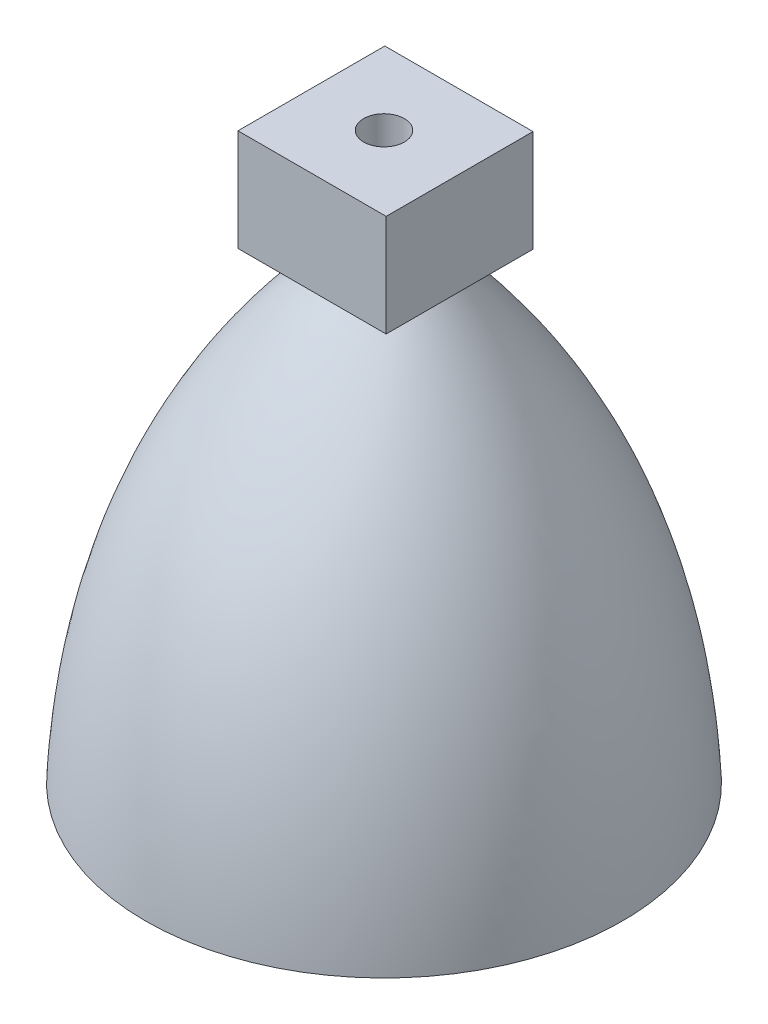
ISO-10303-21;
HEADER;
FILE_DESCRIPTION(('STEP AP214'),'2;1');
FILE_NAME('part.step','',(''),(''),'','','');
FILE_SCHEMA(('AUTOMOTIVE_DESIGN { 1 0 10303 214 1 1 1 1 }'));
ENDSEC;
DATA;
#1=APPLICATION_CONTEXT('core data for automotive mechanical design processes');
#2=APPLICATION_PROTOCOL_DEFINITION('international standard','automotive_design',2000,#1);
#3=PRODUCT_CONTEXT('',#1,'mechanical');
#4=PRODUCT('Part','Part','',(#3));
#5=PRODUCT_RELATED_PRODUCT_CATEGORY('part','',(#4));
#6=PRODUCT_DEFINITION_FORMATION('','',#4);
#7=PRODUCT_DEFINITION_CONTEXT('part definition',#1,'design');
#8=PRODUCT_DEFINITION('design','',#6,#7);
#9=PRODUCT_DEFINITION_SHAPE('','',#8);
#10=(LENGTH_UNIT() NAMED_UNIT(*) SI_UNIT(.MILLI.,.METRE.));
#11=(NAMED_UNIT(*) PLANE_ANGLE_UNIT() SI_UNIT($,.RADIAN.));
#12=(NAMED_UNIT(*) SI_UNIT($,.STERADIAN.) SOLID_ANGLE_UNIT());
#13=UNCERTAINTY_MEASURE_WITH_UNIT(LENGTH_MEASURE(1.E-05),#10,'distance_accuracy_value','');
#14=(GEOMETRIC_REPRESENTATION_CONTEXT(3) GLOBAL_UNCERTAINTY_ASSIGNED_CONTEXT((#13)) GLOBAL_UNIT_ASSIGNED_CONTEXT((#10,
#11,#12)) REPRESENTATION_CONTEXT('',''));
#15=CARTESIAN_POINT('',(0.,0.,0.));
#16=DIRECTION('',(0.,0.,1.));
#17=DIRECTION('',(1.,0.,0.));
#18=AXIS2_PLACEMENT_3D('',#15,#16,#17);
#19=CARTESIAN_POINT('',(2.57269583525705,-4.19029471116209,0.));
#20=CARTESIAN_POINT('',(3.25680347691071,-4.86326423119886,0.));
#21=CARTESIAN_POINT('',(4.11193802897779,-5.70447613124483,0.));
#22=CARTESIAN_POINT('',(5.05258603625154,-6.62980922129537,0.));
#23=CARTESIAN_POINT('',(5.35188312947504,-6.92423338631147,0.));
#24=CARTESIAN_POINT('',(5.48015331228509,-7.05041517131836,0.));
#25=CARTESIAN_POINT('',(5.5656667674918,-7.13453636132296,0.));
#26=CARTESIAN_POINT('',(5.60649605951938,-7.17470367068127,0.));
#27=CARTESIAN_POINT('',(5.97578466494812,-7.53834926105069,0.));
#28=CARTESIAN_POINT('',(7.61077914214302,-9.1575957724003,0.));
#29=CARTESIAN_POINT('',(9.21435597839581,-10.7920633671654,0.));
#30=CARTESIAN_POINT('',(13.0028036140769,-14.7440413484121,0.));
#31=CARTESIAN_POINT('',(15.4482524933547,-17.417695303048,0.));
#32=CARTESIAN_POINT('',(22.5455668317679,-25.5561124461218,0.));
#33=CARTESIAN_POINT('',(26.9584229295394,-31.1382378361443,0.));
#34=CARTESIAN_POINT('',(39.2528678085793,-48.3610729421576,0.));
#35=CARTESIAN_POINT('',(46.1916724620923,-60.4773545155624,0.));
#36=CARTESIAN_POINT('',(57.598611584925,-86.0452802456351,0.));
#37=CARTESIAN_POINT('',(62.0669876663382,-99.4984169967008,0.));
#38=CARTESIAN_POINT('',(68.532442748688,-127.817141379017,0.));
#39=CARTESIAN_POINT('',(70.5286106094791,-142.68347293495,0.));
#40=CARTESIAN_POINT('',(71.2709900106967,-158.279530914894,0.));
#41=B_SPLINE_CURVE_WITH_KNOTS('',3,(#19,#20,#21,#22,#23,#24,#25,#26,#27,#28,#29,#30,#31,#32,#33,
#34,#35,#36,#37,#38,#39,#40),.UNSPECIFIED.,.F.,.F.,(4,1,1,1,2,2,1,2,2,2,2,2,4),(0.,
0.0156249999999998,0.0195312499999998,0.0214843749999998,0.0224609374999998,0.0234374999999998,
0.0312499999999998,0.0624999999999998,0.125,0.25,0.5,0.75,1.),.UNSPECIFIED.);
#42=CARTESIAN_POINT('',(0.,175.609756097561,0.));
#43=DIRECTION('',(0.,1.,0.));
#44=AXIS1_PLACEMENT('',#42,#43);
#45=SURFACE_OF_REVOLUTION('',#41,#44);
#46=CARTESIAN_POINT('',(0.,-8.48404079396581,0.));
#47=DIRECTION('',(0.,1.,0.));
#48=DIRECTION('',(0.,0.,1.));
#49=AXIS2_PLACEMENT_3D('',#46,#47,#48);
#50=CIRCLE('',#49,6.92656428034865);
#51=CARTESIAN_POINT('',(0.,-8.48404079396581,6.92656428034865));
#52=VERTEX_POINT('',#51);
#53=EDGE_CURVE('E108',#52,#52,#50,.T.);
#54=ORIENTED_EDGE('',*,*,#53,.T.);
#55=EDGE_LOOP('',(#54));
#56=FACE_BOUND('',#55,.T.);
#57=CARTESIAN_POINT('',(0.,-158.279530914894,0.));
#58=DIRECTION('',(0.,1.,0.));
#59=DIRECTION('',(0.,0.,1.));
#60=AXIS2_PLACEMENT_3D('',#57,#58,#59);
#61=CIRCLE('',#60,71.2709900106967);
#62=CARTESIAN_POINT('',(0.,-158.279530914894,71.2709900106967));
#63=VERTEX_POINT('',#62);
#64=EDGE_CURVE('E11',#63,#63,#61,.T.);
#65=ORIENTED_EDGE('',*,*,#64,.F.);
#66=EDGE_LOOP('',(#65));
#67=FACE_BOUND('',#66,.T.);
#68=ADVANCED_FACE('F37',(#56,#67),#45,.T.);
#69=CARTESIAN_POINT('',(0.,-157.804064751601,0.));
#70=DIRECTION('',(0.,1.,0.));
#71=DIRECTION('',(0.,0.,1.));
#72=AXIS2_PLACEMENT_3D('',#69,#70,#71);
#73=CONICAL_SURFACE('',#72,81.2596802114969,1.52323177759654);
#74=ORIENTED_EDGE('',*,*,#64,.T.);
#75=EDGE_LOOP('',(#74));
#76=FACE_BOUND('',#75,.T.);
#77=CARTESIAN_POINT('',(0.,-157.804064751601,0.));
#78=DIRECTION('',(0.,1.,0.));
#79=DIRECTION('',(0.,0.,1.));
#80=AXIS2_PLACEMENT_3D('',#77,#78,#79);
#81=CIRCLE('',#80,81.2596802114969);
#82=CARTESIAN_POINT('',(0.,-157.804064751601,81.2596802114969));
#83=VERTEX_POINT('',#82);
#84=EDGE_CURVE('E46',#83,#83,#81,.T.);
#85=ORIENTED_EDGE('',*,*,#84,.F.);
#86=EDGE_LOOP('',(#85));
#87=FACE_BOUND('',#86,.T.);
#88=ADVANCED_FACE('F134',(#76,#87),#73,.T.);
#89=CARTESIAN_POINT('',(12.5726958352571,0.,0.));
#90=CARTESIAN_POINT('',(76.7534275807972,-63.1357897625581,0.));
#91=CARTESIAN_POINT('',(81.2596802114969,-157.804064751601,0.));
#92=B_SPLINE_CURVE_WITH_KNOTS('',2,(#89,#90,#91),.UNSPECIFIED.,.F.,.F.,(3,3),(0.,1.),.UNSPECIFIED.);
#93=CARTESIAN_POINT('',(0.,175.609756097561,0.));
#94=DIRECTION('',(0.,1.,0.));
#95=AXIS1_PLACEMENT('',#93,#94);
#96=SURFACE_OF_REVOLUTION('',#92,#95);
#97=ORIENTED_EDGE('',*,*,#84,.T.);
#98=EDGE_LOOP('',(#97));
#99=FACE_BOUND('',#98,.T.);
#100=CARTESIAN_POINT('',(0.,0.,0.));
#101=DIRECTION('',(0.,1.,0.));
#102=DIRECTION('',(0.,0.,1.));
#103=AXIS2_PLACEMENT_3D('',#100,#101,#102);
#104=CIRCLE('',#103,12.5726958352571);
#105=CARTESIAN_POINT('',(0.,0.,12.5726958352571));
#106=VERTEX_POINT('',#105);
#107=EDGE_CURVE('E114',#106,#106,#104,.T.);
#108=ORIENTED_EDGE('',*,*,#107,.F.);
#109=EDGE_LOOP('',(#108));
#110=FACE_BOUND('',#109,.T.);
#111=ADVANCED_FACE('F130',(#99,#110),#96,.F.);
#112=CARTESIAN_POINT('',(-24.7201572456779,34.7029251277262,25.));
#113=DIRECTION('',(1.,0.,0.));
#114=DIRECTION('',(0.,0.,-1.));
#115=AXIS2_PLACEMENT_3D('',#112,#113,#114);
#116=PLANE('',#115);
#117=DIRECTION('',(0.,-1.,0.));
#118=VECTOR('',#117,1.);
#119=CARTESIAN_POINT('',(-24.7201572456779,34.7029251277262,-25.));
#120=LINE('',#119,#118);
#121=CARTESIAN_POINT('',(-24.7201572456779,34.7029251277262,-25.));
#122=VERTEX_POINT('',#121);
#123=CARTESIAN_POINT('',(-24.7201572456779,0.,-25.));
#124=VERTEX_POINT('',#123);
#125=EDGE_CURVE('E105',#122,#124,#120,.T.);
#126=ORIENTED_EDGE('',*,*,#125,.T.);
#127=DIRECTION('',(0.,0.,-1.));
#128=VECTOR('',#127,1.);
#129=CARTESIAN_POINT('',(-24.7201572456779,0.,25.));
#130=LINE('',#129,#128);
#131=CARTESIAN_POINT('',(-24.7201572456779,0.,25.));
#132=VERTEX_POINT('',#131);
#133=EDGE_CURVE('E96',#132,#124,#130,.T.);
#134=ORIENTED_EDGE('',*,*,#133,.F.);
#135=DIRECTION('',(0.,-1.,0.));
#136=VECTOR('',#135,1.);
#137=CARTESIAN_POINT('',(-24.7201572456779,34.7029251277262,25.));
#138=LINE('',#137,#136);
#139=CARTESIAN_POINT('',(-24.7201572456779,34.7029251277262,25.));
#140=VERTEX_POINT('',#139);
#141=EDGE_CURVE('E90',#140,#132,#138,.T.);
#142=ORIENTED_EDGE('',*,*,#141,.F.);
#143=DIRECTION('',(0.,0.,-1.));
#144=VECTOR('',#143,1.);
#145=CARTESIAN_POINT('',(-24.7201572456779,34.7029251277262,25.));
#146=LINE('',#145,#144);
#147=EDGE_CURVE('E101',#140,#122,#146,.T.);
#148=ORIENTED_EDGE('',*,*,#147,.T.);
#149=EDGE_LOOP('',(#126,#134,#142,#148));
#150=FACE_BOUND('',#149,.T.);
#151=ADVANCED_FACE('F133',(#150),#116,.F.);
#152=CARTESIAN_POINT('',(-24.7201572456779,0.,25.));
#153=DIRECTION('',(0.,1.,0.));
#154=DIRECTION('',(0.,0.,1.));
#155=AXIS2_PLACEMENT_3D('',#152,#153,#154);
#156=PLANE('',#155);
#157=ORIENTED_EDGE('',*,*,#107,.T.);
#158=EDGE_LOOP('',(#157));
#159=FACE_BOUND('',#158,.T.);
#160=DIRECTION('',(1.,0.,0.));
#161=VECTOR('',#160,1.);
#162=CARTESIAN_POINT('',(-24.7201572456779,0.,-25.));
#163=LINE('',#162,#161);
#164=CARTESIAN_POINT('',(25.7347283091132,0.,-25.));
#165=VERTEX_POINT('',#164);
#166=EDGE_CURVE('E95',#124,#165,#163,.T.);
#167=ORIENTED_EDGE('',*,*,#166,.T.);
#168=DIRECTION('',(0.,0.,-1.));
#169=VECTOR('',#168,1.);
#170=CARTESIAN_POINT('',(25.7347283091132,0.,25.));
#171=LINE('',#170,#169);
#172=CARTESIAN_POINT('',(25.7347283091132,0.,25.));
#173=VERTEX_POINT('',#172);
#174=EDGE_CURVE('E93',#173,#165,#171,.T.);
#175=ORIENTED_EDGE('',*,*,#174,.F.);
#176=DIRECTION('',(1.,0.,0.));
#177=VECTOR('',#176,1.);
#178=CARTESIAN_POINT('',(-24.7201572456779,0.,25.));
#179=LINE('',#178,#177);
#180=EDGE_CURVE('E85',#132,#173,#179,.T.);
#181=ORIENTED_EDGE('',*,*,#180,.F.);
#182=ORIENTED_EDGE('',*,*,#133,.T.);
#183=EDGE_LOOP('',(#167,#175,#181,#182));
#184=FACE_BOUND('',#183,.T.);
#185=ADVANCED_FACE('F94',(#159,#184),#156,.F.);
#186=CARTESIAN_POINT('',(25.7347283091132,34.7029251277262,25.));
#187=DIRECTION('',(-1.,0.,0.));
#188=DIRECTION('',(0.,0.,1.));
#189=AXIS2_PLACEMENT_3D('',#186,#187,#188);
#190=PLANE('',#189);
#191=DIRECTION('',(0.,1.,0.));
#192=VECTOR('',#191,1.);
#193=CARTESIAN_POINT('',(25.7347283091132,34.7029251277262,-25.));
#194=LINE('',#193,#192);
#195=CARTESIAN_POINT('',(25.7347283091132,34.7029251277262,-25.));
#196=VERTEX_POINT('',#195);
#197=EDGE_CURVE('E71',#165,#196,#194,.T.);
#198=ORIENTED_EDGE('',*,*,#197,.T.);
#199=DIRECTION('',(0.,0.,-1.));
#200=VECTOR('',#199,1.);
#201=CARTESIAN_POINT('',(25.7347283091132,34.7029251277262,25.));
#202=LINE('',#201,#200);
#203=CARTESIAN_POINT('',(25.7347283091132,34.7029251277262,25.));
#204=VERTEX_POINT('',#203);
#205=EDGE_CURVE('E97',#204,#196,#202,.T.);
#206=ORIENTED_EDGE('',*,*,#205,.F.);
#207=DIRECTION('',(0.,1.,0.));
#208=VECTOR('',#207,1.);
#209=CARTESIAN_POINT('',(25.7347283091132,34.7029251277262,25.));
#210=LINE('',#209,#208);
#211=EDGE_CURVE('E88',#173,#204,#210,.T.);
#212=ORIENTED_EDGE('',*,*,#211,.F.);
#213=ORIENTED_EDGE('',*,*,#174,.T.);
#214=EDGE_LOOP('',(#198,#206,#212,#213));
#215=FACE_BOUND('',#214,.T.);
#216=ADVANCED_FACE('F99',(#215),#190,.F.);
#217=CARTESIAN_POINT('',(-24.7201572456779,34.7029251277262,25.));
#218=DIRECTION('',(0.,-1.,0.));
#219=DIRECTION('',(0.,0.,-1.));
#220=AXIS2_PLACEMENT_3D('',#217,#218,#219);
#221=PLANE('',#220);
#222=CARTESIAN_POINT('',(0.,34.7029251277262,0.));
#223=DIRECTION('',(0.,1.,0.));
#224=DIRECTION('',(0.,0.,1.));
#225=AXIS2_PLACEMENT_3D('',#222,#223,#224);
#226=CIRCLE('',#225,6.92656428034865);
#227=CARTESIAN_POINT('',(0.,34.7029251277262,6.92656428034865));
#228=VERTEX_POINT('',#227);
#229=EDGE_CURVE('E177',#228,#228,#226,.T.);
#230=ORIENTED_EDGE('',*,*,#229,.F.);
#231=EDGE_LOOP('',(#230));
#232=FACE_BOUND('',#231,.T.);
#233=DIRECTION('',(-1.,0.,0.));
#234=VECTOR('',#233,1.);
#235=CARTESIAN_POINT('',(-24.7201572456779,34.7029251277262,-25.));
#236=LINE('',#235,#234);
#237=EDGE_CURVE('E77',#196,#122,#236,.T.);
#238=ORIENTED_EDGE('',*,*,#237,.T.);
#239=ORIENTED_EDGE('',*,*,#147,.F.);
#240=DIRECTION('',(-1.,0.,0.));
#241=VECTOR('',#240,1.);
#242=CARTESIAN_POINT('',(-24.7201572456779,34.7029251277262,25.));
#243=LINE('',#242,#241);
#244=EDGE_CURVE('E54',#204,#140,#243,.T.);
#245=ORIENTED_EDGE('',*,*,#244,.F.);
#246=ORIENTED_EDGE('',*,*,#205,.T.);
#247=EDGE_LOOP('',(#238,#239,#245,#246));
#248=FACE_BOUND('',#247,.T.);
#249=ADVANCED_FACE('F156',(#232,#248),#221,.F.);
#250=CARTESIAN_POINT('',(0.,0.,25.));
#251=DIRECTION('',(0.,0.,1.));
#252=DIRECTION('',(1.,0.,0.));
#253=AXIS2_PLACEMENT_3D('',#250,#251,#252);
#254=PLANE('',#253);
#255=ORIENTED_EDGE('',*,*,#141,.T.);
#256=ORIENTED_EDGE('',*,*,#180,.T.);
#257=ORIENTED_EDGE('',*,*,#211,.T.);
#258=ORIENTED_EDGE('',*,*,#244,.T.);
#259=EDGE_LOOP('',(#255,#256,#257,#258));
#260=FACE_BOUND('',#259,.T.);
#261=ADVANCED_FACE('F86',(#260),#254,.T.);
#262=CARTESIAN_POINT('',(0.,0.,-25.));
#263=DIRECTION('',(0.,0.,1.));
#264=DIRECTION('',(1.,0.,0.));
#265=AXIS2_PLACEMENT_3D('',#262,#263,#264);
#266=PLANE('',#265);
#267=ORIENTED_EDGE('',*,*,#125,.F.);
#268=ORIENTED_EDGE('',*,*,#237,.F.);
#269=ORIENTED_EDGE('',*,*,#197,.F.);
#270=ORIENTED_EDGE('',*,*,#166,.F.);
#271=EDGE_LOOP('',(#267,#268,#269,#270));
#272=FACE_BOUND('',#271,.T.);
#273=ADVANCED_FACE('F163',(#272),#266,.F.);
#274=CARTESIAN_POINT('',(0.,-15.2970748722738,0.));
#275=DIRECTION('',(0.,1.,0.));
#276=DIRECTION('',(0.,0.,1.));
#277=AXIS2_PLACEMENT_3D('',#274,#275,#276);
#278=CYLINDRICAL_SURFACE('',#277,6.92656428034865);
#279=ORIENTED_EDGE('',*,*,#229,.T.);
#280=EDGE_LOOP('',(#279));
#281=FACE_BOUND('',#280,.T.);
#282=ORIENTED_EDGE('',*,*,#53,.F.);
#283=EDGE_LOOP('',(#282));
#284=FACE_BOUND('',#283,.T.);
#285=ADVANCED_FACE('F166',(#281,#284),#278,.F.);
#286=CLOSED_SHELL('',(#68,#88,#111,#151,#185,#216,#249,#261,#273,#285));
#287=MANIFOLD_SOLID_BREP('B2',#286);
#288=ADVANCED_BREP_SHAPE_REPRESENTATION('',(#18,#287),#14);
#289=SHAPE_DEFINITION_REPRESENTATION(#9,#288);
ENDSEC;
END-ISO-10303-21;
